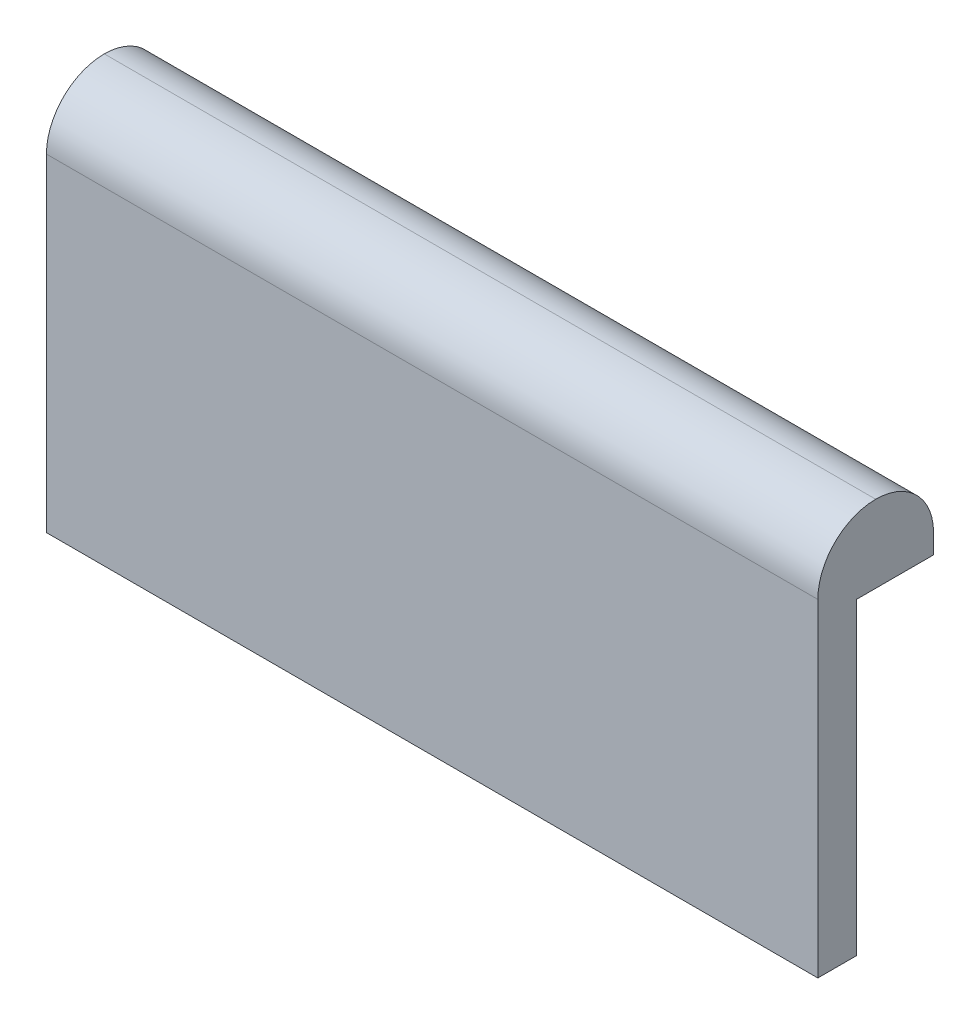
ISO-10303-21;
HEADER;
FILE_DESCRIPTION(('STEP AP214'),'2;1');
FILE_NAME('part.step','',(''),(''),'','','');
FILE_SCHEMA(('AUTOMOTIVE_DESIGN { 1 0 10303 214 1 1 1 1 }'));
ENDSEC;
DATA;
#1=APPLICATION_CONTEXT('core data for automotive mechanical design processes');
#2=APPLICATION_PROTOCOL_DEFINITION('international standard','automotive_design',2000,#1);
#3=PRODUCT_CONTEXT('',#1,'mechanical');
#4=PRODUCT('Part','Part','',(#3));
#5=PRODUCT_RELATED_PRODUCT_CATEGORY('part','',(#4));
#6=PRODUCT_DEFINITION_FORMATION('','',#4);
#7=PRODUCT_DEFINITION_CONTEXT('part definition',#1,'design');
#8=PRODUCT_DEFINITION('design','',#6,#7);
#9=PRODUCT_DEFINITION_SHAPE('','',#8);
#10=(LENGTH_UNIT() NAMED_UNIT(*) SI_UNIT(.MILLI.,.METRE.));
#11=(NAMED_UNIT(*) PLANE_ANGLE_UNIT() SI_UNIT($,.RADIAN.));
#12=(NAMED_UNIT(*) SI_UNIT($,.STERADIAN.) SOLID_ANGLE_UNIT());
#13=UNCERTAINTY_MEASURE_WITH_UNIT(LENGTH_MEASURE(1.E-05),#10,'distance_accuracy_value','');
#14=(GEOMETRIC_REPRESENTATION_CONTEXT(3) GLOBAL_UNCERTAINTY_ASSIGNED_CONTEXT((#13)) GLOBAL_UNIT_ASSIGNED_CONTEXT((#10,
#11,#12)) REPRESENTATION_CONTEXT('',''));
#15=CARTESIAN_POINT('',(0.,0.,0.));
#16=DIRECTION('',(0.,0.,1.));
#17=DIRECTION('',(1.,0.,0.));
#18=AXIS2_PLACEMENT_3D('',#15,#16,#17);
#19=CARTESIAN_POINT('',(155.,-2.50000000000003,35.3606367334853));
#20=DIRECTION('',(1.,0.,0.));
#21=DIRECTION('',(0.,1.,0.));
#22=AXIS2_PLACEMENT_3D('',#19,#20,#21);
#23=CYLINDRICAL_SURFACE('',#22,7.5);
#24=DIRECTION('',(-1.,0.,0.));
#25=VECTOR('',#24,1.);
#26=CARTESIAN_POINT('',(155.,4.99999999999997,35.3606367334853));
#27=LINE('',#26,#25);
#28=CARTESIAN_POINT('',(155.,4.99999999999997,35.3606367334853));
#29=VERTEX_POINT('',#28);
#30=CARTESIAN_POINT('',(255.,4.99999999999997,35.3606367334853));
#31=VERTEX_POINT('',#30);
#32=EDGE_CURVE('E142',#29,#31,#27,.F.);
#33=ORIENTED_EDGE('',*,*,#32,.T.);
#34=CARTESIAN_POINT('',(255.,-2.50000000000003,35.3606367334853));
#35=DIRECTION('',(-1.,0.,0.));
#36=DIRECTION('',(0.,0.,1.));
#37=AXIS2_PLACEMENT_3D('',#34,#35,#36);
#38=CIRCLE('',#37,7.5);
#39=CARTESIAN_POINT('',(255.,-2.50000000000003,27.8606367334853));
#40=VERTEX_POINT('',#39);
#41=EDGE_CURVE('E45',#40,#31,#38,.F.);
#42=ORIENTED_EDGE('',*,*,#41,.F.);
#43=DIRECTION('',(-1.,0.,0.));
#44=VECTOR('',#43,1.);
#45=CARTESIAN_POINT('',(155.,-2.50000000000003,27.8606367334853));
#46=LINE('',#45,#44);
#47=CARTESIAN_POINT('',(155.,-2.50000000000003,27.8606367334853));
#48=VERTEX_POINT('',#47);
#49=EDGE_CURVE('E99',#48,#40,#46,.F.);
#50=ORIENTED_EDGE('',*,*,#49,.F.);
#51=CARTESIAN_POINT('',(155.,-2.50000000000003,35.3606367334853));
#52=DIRECTION('',(1.,0.,0.));
#53=DIRECTION('',(0.,0.,-1.));
#54=AXIS2_PLACEMENT_3D('',#51,#52,#53);
#55=CIRCLE('',#54,7.5);
#56=EDGE_CURVE('E11',#29,#48,#55,.F.);
#57=ORIENTED_EDGE('',*,*,#56,.F.);
#58=EDGE_LOOP('',(#33,#42,#50,#57));
#59=FACE_BOUND('',#58,.T.);
#60=ADVANCED_FACE('F38',(#59),#23,.T.);
#61=CARTESIAN_POINT('',(0.,-2.50000000000003,35.3606367334853));
#62=DIRECTION('',(-1.,0.,0.));
#63=DIRECTION('',(0.,-1.,0.));
#64=AXIS2_PLACEMENT_3D('',#61,#62,#63);
#65=CYLINDRICAL_SURFACE('',#64,7.5);
#66=DIRECTION('',(-1.,0.,0.));
#67=VECTOR('',#66,1.);
#68=CARTESIAN_POINT('',(0.,-2.50000000000003,42.8606367334853));
#69=LINE('',#68,#67);
#70=CARTESIAN_POINT('',(255.,-2.50000000000002,42.8606367334853));
#71=VERTEX_POINT('',#70);
#72=CARTESIAN_POINT('',(155.,-2.50000000000003,42.8606367334853));
#73=VERTEX_POINT('',#72);
#74=EDGE_CURVE('E139',#71,#73,#69,.T.);
#75=ORIENTED_EDGE('',*,*,#74,.F.);
#76=CARTESIAN_POINT('',(255.,-2.50000000000003,35.3606367334853));
#77=DIRECTION('',(-1.,0.,0.));
#78=DIRECTION('',(0.,0.,1.));
#79=AXIS2_PLACEMENT_3D('',#76,#77,#78);
#80=CIRCLE('',#79,7.5);
#81=EDGE_CURVE('E144',#31,#71,#80,.F.);
#82=ORIENTED_EDGE('',*,*,#81,.F.);
#83=ORIENTED_EDGE('',*,*,#32,.F.);
#84=CARTESIAN_POINT('',(155.,-2.50000000000003,35.3606367334853));
#85=DIRECTION('',(1.,0.,0.));
#86=DIRECTION('',(0.,0.,-1.));
#87=AXIS2_PLACEMENT_3D('',#84,#85,#86);
#88=CIRCLE('',#87,7.5);
#89=EDGE_CURVE('E146',#73,#29,#88,.F.);
#90=ORIENTED_EDGE('',*,*,#89,.F.);
#91=EDGE_LOOP('',(#75,#82,#83,#90));
#92=FACE_BOUND('',#91,.T.);
#93=ADVANCED_FACE('F153',(#92),#65,.T.);
#94=CARTESIAN_POINT('',(155.,-45.,42.8606367334853));
#95=DIRECTION('',(1.,0.,0.));
#96=DIRECTION('',(0.,0.,-1.));
#97=AXIS2_PLACEMENT_3D('',#94,#95,#96);
#98=PLANE('',#97);
#99=ORIENTED_EDGE('',*,*,#89,.T.);
#100=ORIENTED_EDGE('',*,*,#56,.T.);
#101=DIRECTION('',(0.,1.,0.));
#102=VECTOR('',#101,1.);
#103=CARTESIAN_POINT('',(155.,4.99999999999997,27.8606367334853));
#104=LINE('',#103,#102);
#105=CARTESIAN_POINT('',(155.,-5.00000000000004,27.8606367334853));
#106=VERTEX_POINT('',#105);
#107=EDGE_CURVE('E111',#106,#48,#104,.T.);
#108=ORIENTED_EDGE('',*,*,#107,.F.);
#109=DIRECTION('',(0.,0.,1.));
#110=VECTOR('',#109,1.);
#111=CARTESIAN_POINT('',(155.,-5.00000000000004,27.8606367334853));
#112=LINE('',#111,#110);
#113=CARTESIAN_POINT('',(155.,-5.00000000000004,37.8606367334853));
#114=VERTEX_POINT('',#113);
#115=EDGE_CURVE('E110',#106,#114,#112,.T.);
#116=ORIENTED_EDGE('',*,*,#115,.T.);
#117=DIRECTION('',(0.,-1.,0.));
#118=VECTOR('',#117,1.);
#119=CARTESIAN_POINT('',(155.,-45.,37.8606367334853));
#120=LINE('',#119,#118);
#121=CARTESIAN_POINT('',(155.,-45.,37.8606367334853));
#122=VERTEX_POINT('',#121);
#123=EDGE_CURVE('E118',#114,#122,#120,.T.);
#124=ORIENTED_EDGE('',*,*,#123,.T.);
#125=DIRECTION('',(0.,0.,-1.));
#126=VECTOR('',#125,1.);
#127=CARTESIAN_POINT('',(155.,-45.,42.8606367334853));
#128=LINE('',#127,#126);
#129=CARTESIAN_POINT('',(155.,-45.,42.8606367334853));
#130=VERTEX_POINT('',#129);
#131=EDGE_CURVE('E136',#130,#122,#128,.T.);
#132=ORIENTED_EDGE('',*,*,#131,.F.);
#133=DIRECTION('',(0.,-1.,0.));
#134=VECTOR('',#133,1.);
#135=CARTESIAN_POINT('',(155.,-45.,42.8606367334853));
#136=LINE('',#135,#134);
#137=EDGE_CURVE('E125',#73,#130,#136,.T.);
#138=ORIENTED_EDGE('',*,*,#137,.F.);
#139=EDGE_LOOP('',(#99,#100,#108,#116,#124,#132,#138));
#140=FACE_BOUND('',#139,.T.);
#141=ADVANCED_FACE('F155',(#140),#98,.F.);
#142=CARTESIAN_POINT('',(155.,-45.,42.8606367334853));
#143=DIRECTION('',(0.,1.,0.));
#144=DIRECTION('',(0.,0.,1.));
#145=AXIS2_PLACEMENT_3D('',#142,#143,#144);
#146=PLANE('',#145);
#147=DIRECTION('',(1.,0.,0.));
#148=VECTOR('',#147,1.);
#149=CARTESIAN_POINT('',(155.,-45.,37.8606367334853));
#150=LINE('',#149,#148);
#151=CARTESIAN_POINT('',(255.,-45.,37.8606367334853));
#152=VERTEX_POINT('',#151);
#153=EDGE_CURVE('E120',#122,#152,#150,.T.);
#154=ORIENTED_EDGE('',*,*,#153,.T.);
#155=DIRECTION('',(0.,0.,-1.));
#156=VECTOR('',#155,1.);
#157=CARTESIAN_POINT('',(255.,-45.,42.8606367334853));
#158=LINE('',#157,#156);
#159=CARTESIAN_POINT('',(255.,-45.,42.8606367334853));
#160=VERTEX_POINT('',#159);
#161=EDGE_CURVE('E131',#160,#152,#158,.T.);
#162=ORIENTED_EDGE('',*,*,#161,.F.);
#163=DIRECTION('',(1.,0.,0.));
#164=VECTOR('',#163,1.);
#165=CARTESIAN_POINT('',(155.,-45.,42.8606367334853));
#166=LINE('',#165,#164);
#167=EDGE_CURVE('E127',#130,#160,#166,.T.);
#168=ORIENTED_EDGE('',*,*,#167,.F.);
#169=ORIENTED_EDGE('',*,*,#131,.T.);
#170=EDGE_LOOP('',(#154,#162,#168,#169));
#171=FACE_BOUND('',#170,.T.);
#172=ADVANCED_FACE('F166',(#171),#146,.F.);
#173=CARTESIAN_POINT('',(255.,-45.,42.8606367334853));
#174=DIRECTION('',(-1.,0.,0.));
#175=DIRECTION('',(0.,0.,1.));
#176=AXIS2_PLACEMENT_3D('',#173,#174,#175);
#177=PLANE('',#176);
#178=DIRECTION('',(0.,-1.,0.));
#179=VECTOR('',#178,1.);
#180=CARTESIAN_POINT('',(255.,4.99999999999997,27.8606367334853));
#181=LINE('',#180,#179);
#182=CARTESIAN_POINT('',(255.,-5.00000000000004,27.8606367334853));
#183=VERTEX_POINT('',#182);
#184=EDGE_CURVE('E93',#40,#183,#181,.T.);
#185=ORIENTED_EDGE('',*,*,#184,.F.);
#186=ORIENTED_EDGE('',*,*,#41,.T.);
#187=ORIENTED_EDGE('',*,*,#81,.T.);
#188=DIRECTION('',(0.,1.,0.));
#189=VECTOR('',#188,1.);
#190=CARTESIAN_POINT('',(255.,-45.,42.8606367334853));
#191=LINE('',#190,#189);
#192=EDGE_CURVE('E129',#160,#71,#191,.T.);
#193=ORIENTED_EDGE('',*,*,#192,.F.);
#194=ORIENTED_EDGE('',*,*,#161,.T.);
#195=DIRECTION('',(0.,1.,0.));
#196=VECTOR('',#195,1.);
#197=CARTESIAN_POINT('',(255.,-45.,37.8606367334853));
#198=LINE('',#197,#196);
#199=CARTESIAN_POINT('',(255.,-5.00000000000004,37.8606367334853));
#200=VERTEX_POINT('',#199);
#201=EDGE_CURVE('E117',#152,#200,#198,.T.);
#202=ORIENTED_EDGE('',*,*,#201,.T.);
#203=DIRECTION('',(0.,0.,1.));
#204=VECTOR('',#203,1.);
#205=CARTESIAN_POINT('',(255.,-5.00000000000004,27.8606367334853));
#206=LINE('',#205,#204);
#207=EDGE_CURVE('E108',#183,#200,#206,.T.);
#208=ORIENTED_EDGE('',*,*,#207,.F.);
#209=EDGE_LOOP('',(#185,#186,#187,#193,#194,#202,#208));
#210=FACE_BOUND('',#209,.T.);
#211=ADVANCED_FACE('F114',(#210),#177,.F.);
#212=CARTESIAN_POINT('',(0.,0.,42.8606367334853));
#213=DIRECTION('',(0.,0.,-1.));
#214=DIRECTION('',(-1.,0.,0.));
#215=AXIS2_PLACEMENT_3D('',#212,#213,#214);
#216=PLANE('',#215);
#217=ORIENTED_EDGE('',*,*,#192,.T.);
#218=ORIENTED_EDGE('',*,*,#74,.T.);
#219=ORIENTED_EDGE('',*,*,#137,.T.);
#220=ORIENTED_EDGE('',*,*,#167,.T.);
#221=EDGE_LOOP('',(#217,#218,#219,#220));
#222=FACE_BOUND('',#221,.T.);
#223=ADVANCED_FACE('F158',(#222),#216,.F.);
#224=CARTESIAN_POINT('',(0.,0.,37.8606367334853));
#225=DIRECTION('',(0.,0.,-1.));
#226=DIRECTION('',(-1.,0.,0.));
#227=AXIS2_PLACEMENT_3D('',#224,#225,#226);
#228=PLANE('',#227);
#229=DIRECTION('',(-1.,0.,0.));
#230=VECTOR('',#229,1.);
#231=CARTESIAN_POINT('',(255.,-5.00000000000004,37.8606367334853));
#232=LINE('',#231,#230);
#233=EDGE_CURVE('E102',#200,#114,#232,.T.);
#234=ORIENTED_EDGE('',*,*,#233,.F.);
#235=ORIENTED_EDGE('',*,*,#201,.F.);
#236=ORIENTED_EDGE('',*,*,#153,.F.);
#237=ORIENTED_EDGE('',*,*,#123,.F.);
#238=EDGE_LOOP('',(#234,#235,#236,#237));
#239=FACE_BOUND('',#238,.T.);
#240=ADVANCED_FACE('F164',(#239),#228,.T.);
#241=CARTESIAN_POINT('',(255.,-5.00000000000004,27.8606367334853));
#242=DIRECTION('',(0.,1.,0.));
#243=DIRECTION('',(0.,0.,1.));
#244=AXIS2_PLACEMENT_3D('',#241,#242,#243);
#245=PLANE('',#244);
#246=ORIENTED_EDGE('',*,*,#233,.T.);
#247=ORIENTED_EDGE('',*,*,#115,.F.);
#248=DIRECTION('',(-1.,0.,0.));
#249=VECTOR('',#248,1.);
#250=CARTESIAN_POINT('',(255.,-5.00000000000004,27.8606367334853));
#251=LINE('',#250,#249);
#252=EDGE_CURVE('E97',#183,#106,#251,.T.);
#253=ORIENTED_EDGE('',*,*,#252,.F.);
#254=ORIENTED_EDGE('',*,*,#207,.T.);
#255=EDGE_LOOP('',(#246,#247,#253,#254));
#256=FACE_BOUND('',#255,.T.);
#257=ADVANCED_FACE('F107',(#256),#245,.F.);
#258=CARTESIAN_POINT('',(0.,0.,27.8606367334853));
#259=DIRECTION('',(0.,0.,-1.));
#260=DIRECTION('',(-1.,0.,0.));
#261=AXIS2_PLACEMENT_3D('',#258,#259,#260);
#262=PLANE('',#261);
#263=ORIENTED_EDGE('',*,*,#107,.T.);
#264=ORIENTED_EDGE('',*,*,#49,.T.);
#265=ORIENTED_EDGE('',*,*,#184,.T.);
#266=ORIENTED_EDGE('',*,*,#252,.T.);
#267=EDGE_LOOP('',(#263,#264,#265,#266));
#268=FACE_BOUND('',#267,.T.);
#269=ADVANCED_FACE('F96',(#268),#262,.T.);
#270=CLOSED_SHELL('',(#60,#93,#141,#172,#211,#223,#240,#257,#269));
#271=MANIFOLD_SOLID_BREP('B2',#270);
#272=ADVANCED_BREP_SHAPE_REPRESENTATION('',(#18,#271),#14);
#273=SHAPE_DEFINITION_REPRESENTATION(#9,#272);
ENDSEC;
END-ISO-10303-21;
